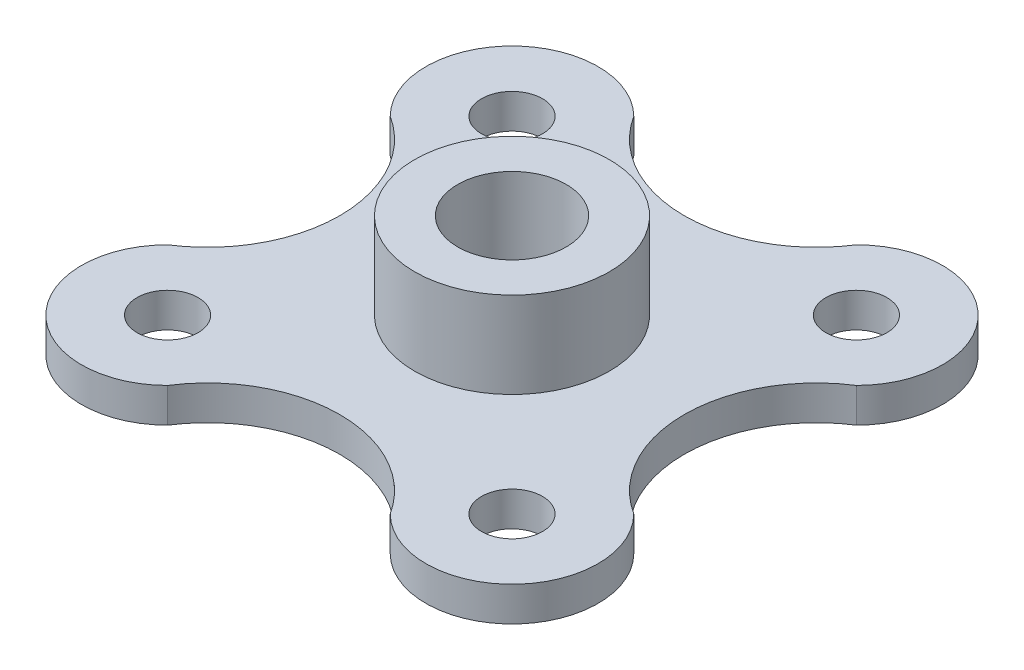
ISO-10303-21;
HEADER;
FILE_DESCRIPTION(('STEP AP214'),'2;1');
FILE_NAME('part.step','',(''),(''),'','','');
FILE_SCHEMA(('AUTOMOTIVE_DESIGN { 1 0 10303 214 1 1 1 1 }'));
ENDSEC;
DATA;
#1=APPLICATION_CONTEXT('core data for automotive mechanical design processes');
#2=APPLICATION_PROTOCOL_DEFINITION('international standard','automotive_design',2000,#1);
#3=PRODUCT_CONTEXT('',#1,'mechanical');
#4=PRODUCT('Part','Part','',(#3));
#5=PRODUCT_RELATED_PRODUCT_CATEGORY('part','',(#4));
#6=PRODUCT_DEFINITION_FORMATION('','',#4);
#7=PRODUCT_DEFINITION_CONTEXT('part definition',#1,'design');
#8=PRODUCT_DEFINITION('design','',#6,#7);
#9=PRODUCT_DEFINITION_SHAPE('','',#8);
#10=(LENGTH_UNIT() NAMED_UNIT(*) SI_UNIT(.MILLI.,.METRE.));
#11=(NAMED_UNIT(*) PLANE_ANGLE_UNIT() SI_UNIT($,.RADIAN.));
#12=(NAMED_UNIT(*) SI_UNIT($,.STERADIAN.) SOLID_ANGLE_UNIT());
#13=UNCERTAINTY_MEASURE_WITH_UNIT(LENGTH_MEASURE(1.E-05),#10,'distance_accuracy_value','');
#14=(GEOMETRIC_REPRESENTATION_CONTEXT(3) GLOBAL_UNCERTAINTY_ASSIGNED_CONTEXT((#13)) GLOBAL_UNIT_ASSIGNED_CONTEXT((#10,
#11,#12)) REPRESENTATION_CONTEXT('',''));
#15=CARTESIAN_POINT('',(0.,0.,0.));
#16=DIRECTION('',(0.,0.,1.));
#17=DIRECTION('',(1.,0.,0.));
#18=AXIS2_PLACEMENT_3D('',#15,#16,#17);
#19=CARTESIAN_POINT('',(-12.7,2.54,12.7));
#20=DIRECTION('',(0.,-1.,0.));
#21=DIRECTION('',(0.,0.,-1.));
#22=AXIS2_PLACEMENT_3D('',#19,#20,#21);
#23=CYLINDRICAL_SURFACE('',#22,6.35);
#24=CARTESIAN_POINT('',(-12.7,0.,12.7));
#25=DIRECTION('',(0.,1.,0.));
#26=DIRECTION('',(0.,0.,1.));
#27=AXIS2_PLACEMENT_3D('',#24,#25,#26);
#28=CIRCLE('',#27,6.35);
#29=CARTESIAN_POINT('',(-17.1901280605346,0.,8.20987193946544));
#30=VERTEX_POINT('',#29);
#31=CARTESIAN_POINT('',(-8.20987193946544,0.,17.1901280605346));
#32=VERTEX_POINT('',#31);
#33=EDGE_CURVE('E142',#30,#32,#28,.T.);
#34=ORIENTED_EDGE('',*,*,#33,.T.);
#35=DIRECTION('',(0.,-1.,0.));
#36=VECTOR('',#35,1.);
#37=CARTESIAN_POINT('',(-8.20987193946544,2.54,17.1901280605346));
#38=LINE('',#37,#36);
#39=CARTESIAN_POINT('',(-8.20987193946544,2.54,17.1901280605346));
#40=VERTEX_POINT('',#39);
#41=EDGE_CURVE('E52',#40,#32,#38,.T.);
#42=ORIENTED_EDGE('',*,*,#41,.F.);
#43=CARTESIAN_POINT('',(-12.7,2.54,12.7));
#44=DIRECTION('',(0.,1.,0.));
#45=DIRECTION('',(0.,0.,1.));
#46=AXIS2_PLACEMENT_3D('',#43,#44,#45);
#47=CIRCLE('',#46,6.35);
#48=CARTESIAN_POINT('',(-17.1901280605346,2.54,8.20987193946544));
#49=VERTEX_POINT('',#48);
#50=EDGE_CURVE('E158',#49,#40,#47,.T.);
#51=ORIENTED_EDGE('',*,*,#50,.F.);
#52=DIRECTION('',(0.,-1.,0.));
#53=VECTOR('',#52,1.);
#54=CARTESIAN_POINT('',(-17.1901280605346,2.54,8.20987193946544));
#55=LINE('',#54,#53);
#56=EDGE_CURVE('E141',#49,#30,#55,.T.);
#57=ORIENTED_EDGE('',*,*,#56,.T.);
#58=EDGE_LOOP('',(#34,#42,#51,#57));
#59=FACE_BOUND('',#58,.T.);
#60=ADVANCED_FACE('F44',(#59),#23,.T.);
#61=CARTESIAN_POINT('',(0.,2.54,22.4506403026729));
#62=DIRECTION('',(0.,-1.,0.));
#63=DIRECTION('',(0.,0.,-1.));
#64=AXIS2_PLACEMENT_3D('',#61,#62,#63);
#65=CYLINDRICAL_SURFACE('',#64,9.75064030267288);
#66=CARTESIAN_POINT('',(0.,0.,22.4506403026729));
#67=DIRECTION('',(0.,1.,0.));
#68=DIRECTION('',(0.,0.,1.));
#69=AXIS2_PLACEMENT_3D('',#66,#67,#68);
#70=CIRCLE('',#69,9.75064030267288);
#71=CARTESIAN_POINT('',(8.20987193946543,0.,17.1901280605346));
#72=VERTEX_POINT('',#71);
#73=EDGE_CURVE('E145',#32,#72,#70,.F.);
#74=ORIENTED_EDGE('',*,*,#73,.T.);
#75=DIRECTION('',(0.,-1.,0.));
#76=VECTOR('',#75,1.);
#77=CARTESIAN_POINT('',(8.20987193946543,2.54,17.1901280605346));
#78=LINE('',#77,#76);
#79=CARTESIAN_POINT('',(8.20987193946543,2.54,17.1901280605346));
#80=VERTEX_POINT('',#79);
#81=EDGE_CURVE('E168',#80,#72,#78,.T.);
#82=ORIENTED_EDGE('',*,*,#81,.F.);
#83=CARTESIAN_POINT('',(0.,2.54,22.4506403026729));
#84=DIRECTION('',(0.,1.,0.));
#85=DIRECTION('',(0.,0.,1.));
#86=AXIS2_PLACEMENT_3D('',#83,#84,#85);
#87=CIRCLE('',#86,9.75064030267288);
#88=EDGE_CURVE('E103',#40,#80,#87,.F.);
#89=ORIENTED_EDGE('',*,*,#88,.F.);
#90=ORIENTED_EDGE('',*,*,#41,.T.);
#91=EDGE_LOOP('',(#74,#82,#89,#90));
#92=FACE_BOUND('',#91,.T.);
#93=ADVANCED_FACE('F171',(#92),#65,.F.);
#94=CARTESIAN_POINT('',(12.7,2.54,12.7));
#95=DIRECTION('',(0.,-1.,0.));
#96=DIRECTION('',(0.,0.,-1.));
#97=AXIS2_PLACEMENT_3D('',#94,#95,#96);
#98=CYLINDRICAL_SURFACE('',#97,6.35);
#99=CARTESIAN_POINT('',(12.7,0.,12.7));
#100=DIRECTION('',(0.,1.,0.));
#101=DIRECTION('',(0.,0.,1.));
#102=AXIS2_PLACEMENT_3D('',#99,#100,#101);
#103=CIRCLE('',#102,6.35);
#104=CARTESIAN_POINT('',(17.1901280605346,0.,8.20987193946543));
#105=VERTEX_POINT('',#104);
#106=EDGE_CURVE('E148',#72,#105,#103,.T.);
#107=ORIENTED_EDGE('',*,*,#106,.T.);
#108=DIRECTION('',(0.,-1.,0.));
#109=VECTOR('',#108,1.);
#110=CARTESIAN_POINT('',(17.1901280605346,2.54,8.20987193946543));
#111=LINE('',#110,#109);
#112=CARTESIAN_POINT('',(17.1901280605346,2.54,8.20987193946543));
#113=VERTEX_POINT('',#112);
#114=EDGE_CURVE('E165',#113,#105,#111,.T.);
#115=ORIENTED_EDGE('',*,*,#114,.F.);
#116=CARTESIAN_POINT('',(12.7,2.54,12.7));
#117=DIRECTION('',(0.,1.,0.));
#118=DIRECTION('',(0.,0.,1.));
#119=AXIS2_PLACEMENT_3D('',#116,#117,#118);
#120=CIRCLE('',#119,6.35);
#121=EDGE_CURVE('E188',#80,#113,#120,.T.);
#122=ORIENTED_EDGE('',*,*,#121,.F.);
#123=ORIENTED_EDGE('',*,*,#81,.T.);
#124=EDGE_LOOP('',(#107,#115,#122,#123));
#125=FACE_BOUND('',#124,.T.);
#126=ADVANCED_FACE('F182',(#125),#98,.T.);
#127=CARTESIAN_POINT('',(22.4506403026729,2.54,0.));
#128=DIRECTION('',(0.,-1.,0.));
#129=DIRECTION('',(0.,0.,-1.));
#130=AXIS2_PLACEMENT_3D('',#127,#128,#129);
#131=CYLINDRICAL_SURFACE('',#130,9.75064030267289);
#132=CARTESIAN_POINT('',(22.4506403026729,0.,0.));
#133=DIRECTION('',(0.,1.,0.));
#134=DIRECTION('',(0.,0.,1.));
#135=AXIS2_PLACEMENT_3D('',#132,#133,#134);
#136=CIRCLE('',#135,9.75064030267289);
#137=CARTESIAN_POINT('',(17.1901280605346,0.,-8.20987193946545));
#138=VERTEX_POINT('',#137);
#139=EDGE_CURVE('E150',#105,#138,#136,.F.);
#140=ORIENTED_EDGE('',*,*,#139,.T.);
#141=DIRECTION('',(0.,-1.,0.));
#142=VECTOR('',#141,1.);
#143=CARTESIAN_POINT('',(17.1901280605346,2.54,-8.20987193946545));
#144=LINE('',#143,#142);
#145=CARTESIAN_POINT('',(17.1901280605346,2.54,-8.20987193946545));
#146=VERTEX_POINT('',#145);
#147=EDGE_CURVE('E162',#146,#138,#144,.T.);
#148=ORIENTED_EDGE('',*,*,#147,.F.);
#149=CARTESIAN_POINT('',(22.4506403026729,2.54,0.));
#150=DIRECTION('',(0.,1.,0.));
#151=DIRECTION('',(0.,0.,1.));
#152=AXIS2_PLACEMENT_3D('',#149,#150,#151);
#153=CIRCLE('',#152,9.75064030267289);
#154=EDGE_CURVE('E136',#113,#146,#153,.F.);
#155=ORIENTED_EDGE('',*,*,#154,.F.);
#156=ORIENTED_EDGE('',*,*,#114,.T.);
#157=EDGE_LOOP('',(#140,#148,#155,#156));
#158=FACE_BOUND('',#157,.T.);
#159=ADVANCED_FACE('F186',(#158),#131,.F.);
#160=CARTESIAN_POINT('',(12.7,2.54,-12.7));
#161=DIRECTION('',(0.,-1.,0.));
#162=DIRECTION('',(0.,0.,-1.));
#163=AXIS2_PLACEMENT_3D('',#160,#161,#162);
#164=CYLINDRICAL_SURFACE('',#163,6.35);
#165=CARTESIAN_POINT('',(12.7,0.,-12.7));
#166=DIRECTION('',(0.,1.,0.));
#167=DIRECTION('',(0.,0.,1.));
#168=AXIS2_PLACEMENT_3D('',#165,#166,#167);
#169=CIRCLE('',#168,6.35);
#170=CARTESIAN_POINT('',(8.20987193946543,0.,-17.1901280605346));
#171=VERTEX_POINT('',#170);
#172=EDGE_CURVE('E152',#138,#171,#169,.T.);
#173=ORIENTED_EDGE('',*,*,#172,.T.);
#174=DIRECTION('',(0.,-1.,0.));
#175=VECTOR('',#174,1.);
#176=CARTESIAN_POINT('',(8.20987193946543,2.54,-17.1901280605346));
#177=LINE('',#176,#175);
#178=CARTESIAN_POINT('',(8.20987193946543,2.54,-17.1901280605346));
#179=VERTEX_POINT('',#178);
#180=EDGE_CURVE('E125',#179,#171,#177,.T.);
#181=ORIENTED_EDGE('',*,*,#180,.F.);
#182=CARTESIAN_POINT('',(12.7,2.54,-12.7));
#183=DIRECTION('',(0.,1.,0.));
#184=DIRECTION('',(0.,0.,1.));
#185=AXIS2_PLACEMENT_3D('',#182,#183,#184);
#186=CIRCLE('',#185,6.35);
#187=EDGE_CURVE('E133',#146,#179,#186,.T.);
#188=ORIENTED_EDGE('',*,*,#187,.F.);
#189=ORIENTED_EDGE('',*,*,#147,.T.);
#190=EDGE_LOOP('',(#173,#181,#188,#189));
#191=FACE_BOUND('',#190,.T.);
#192=ADVANCED_FACE('F267',(#191),#164,.T.);
#193=CARTESIAN_POINT('',(0.,2.54,-22.4506403026729));
#194=DIRECTION('',(0.,-1.,0.));
#195=DIRECTION('',(0.,0.,-1.));
#196=AXIS2_PLACEMENT_3D('',#193,#194,#195);
#197=CYLINDRICAL_SURFACE('',#196,9.75064030267288);
#198=CARTESIAN_POINT('',(0.,0.,-22.4506403026729));
#199=DIRECTION('',(0.,1.,0.));
#200=DIRECTION('',(0.,0.,1.));
#201=AXIS2_PLACEMENT_3D('',#198,#199,#200);
#202=CIRCLE('',#201,9.75064030267288);
#203=CARTESIAN_POINT('',(-8.20987193946543,0.,-17.1901280605346));
#204=VERTEX_POINT('',#203);
#205=EDGE_CURVE('E124',#204,#171,#202,.T.);
#206=ORIENTED_EDGE('',*,*,#205,.F.);
#207=DIRECTION('',(0.,-1.,0.));
#208=VECTOR('',#207,1.);
#209=CARTESIAN_POINT('',(-8.20987193946543,2.54,-17.1901280605346));
#210=LINE('',#209,#208);
#211=CARTESIAN_POINT('',(-8.20987193946543,2.54,-17.1901280605346));
#212=VERTEX_POINT('',#211);
#213=EDGE_CURVE('E118',#212,#204,#210,.T.);
#214=ORIENTED_EDGE('',*,*,#213,.F.);
#215=CARTESIAN_POINT('',(0.,2.54,-22.4506403026729));
#216=DIRECTION('',(0.,1.,0.));
#217=DIRECTION('',(0.,0.,1.));
#218=AXIS2_PLACEMENT_3D('',#215,#216,#217);
#219=CIRCLE('',#218,9.75064030267288);
#220=EDGE_CURVE('E122',#212,#179,#219,.T.);
#221=ORIENTED_EDGE('',*,*,#220,.T.);
#222=ORIENTED_EDGE('',*,*,#180,.T.);
#223=EDGE_LOOP('',(#206,#214,#221,#222));
#224=FACE_BOUND('',#223,.T.);
#225=ADVANCED_FACE('F120',(#224),#197,.F.);
#226=CARTESIAN_POINT('',(-12.7,2.54,-12.7));
#227=DIRECTION('',(0.,-1.,0.));
#228=DIRECTION('',(0.,0.,-1.));
#229=AXIS2_PLACEMENT_3D('',#226,#227,#228);
#230=CYLINDRICAL_SURFACE('',#229,6.35);
#231=CARTESIAN_POINT('',(-12.7,0.,-12.7));
#232=DIRECTION('',(0.,1.,0.));
#233=DIRECTION('',(0.,0.,1.));
#234=AXIS2_PLACEMENT_3D('',#231,#232,#233);
#235=CIRCLE('',#234,6.35);
#236=CARTESIAN_POINT('',(-17.1901280605346,0.,-8.20987193946544));
#237=VERTEX_POINT('',#236);
#238=EDGE_CURVE('E88',#204,#237,#235,.T.);
#239=ORIENTED_EDGE('',*,*,#238,.T.);
#240=DIRECTION('',(0.,-1.,0.));
#241=VECTOR('',#240,1.);
#242=CARTESIAN_POINT('',(-17.1901280605346,2.54,-8.20987193946544));
#243=LINE('',#242,#241);
#244=CARTESIAN_POINT('',(-17.1901280605346,2.54,-8.20987193946544));
#245=VERTEX_POINT('',#244);
#246=EDGE_CURVE('E126',#245,#237,#243,.T.);
#247=ORIENTED_EDGE('',*,*,#246,.F.);
#248=CARTESIAN_POINT('',(-12.7,2.54,-12.7));
#249=DIRECTION('',(0.,1.,0.));
#250=DIRECTION('',(0.,0.,1.));
#251=AXIS2_PLACEMENT_3D('',#248,#249,#250);
#252=CIRCLE('',#251,6.35);
#253=EDGE_CURVE('E128',#212,#245,#252,.T.);
#254=ORIENTED_EDGE('',*,*,#253,.F.);
#255=ORIENTED_EDGE('',*,*,#213,.T.);
#256=EDGE_LOOP('',(#239,#247,#254,#255));
#257=FACE_BOUND('',#256,.T.);
#258=ADVANCED_FACE('F129',(#257),#230,.T.);
#259=CARTESIAN_POINT('',(-22.4506403026729,2.54,0.));
#260=DIRECTION('',(0.,-1.,0.));
#261=DIRECTION('',(0.,0.,-1.));
#262=AXIS2_PLACEMENT_3D('',#259,#260,#261);
#263=CYLINDRICAL_SURFACE('',#262,9.75064030267289);
#264=CARTESIAN_POINT('',(-22.4506403026729,0.,0.));
#265=DIRECTION('',(0.,1.,0.));
#266=DIRECTION('',(0.,0.,1.));
#267=AXIS2_PLACEMENT_3D('',#264,#265,#266);
#268=CIRCLE('',#267,9.75064030267289);
#269=EDGE_CURVE('E94',#237,#30,#268,.F.);
#270=ORIENTED_EDGE('',*,*,#269,.T.);
#271=ORIENTED_EDGE('',*,*,#56,.F.);
#272=CARTESIAN_POINT('',(-22.4506403026729,2.54,0.));
#273=DIRECTION('',(0.,1.,0.));
#274=DIRECTION('',(0.,0.,1.));
#275=AXIS2_PLACEMENT_3D('',#272,#273,#274);
#276=CIRCLE('',#275,9.75064030267289);
#277=EDGE_CURVE('E60',#245,#49,#276,.F.);
#278=ORIENTED_EDGE('',*,*,#277,.F.);
#279=ORIENTED_EDGE('',*,*,#246,.T.);
#280=EDGE_LOOP('',(#270,#271,#278,#279));
#281=FACE_BOUND('',#280,.T.);
#282=ADVANCED_FACE('F230',(#281),#263,.F.);
#283=CARTESIAN_POINT('',(0.,2.54,0.));
#284=DIRECTION('',(0.,1.,0.));
#285=DIRECTION('',(0.,0.,1.));
#286=AXIS2_PLACEMENT_3D('',#283,#284,#285);
#287=PLANE('',#286);
#288=CARTESIAN_POINT('',(-12.7,2.54,-12.7));
#289=DIRECTION('',(0.,1.,0.));
#290=DIRECTION('',(0.,0.,1.));
#291=AXIS2_PLACEMENT_3D('',#288,#289,#290);
#292=CIRCLE('',#291,2.24789999999999);
#293=CARTESIAN_POINT('',(-12.7,2.54,-10.4521));
#294=VERTEX_POINT('',#293);
#295=EDGE_CURVE('E222',#294,#294,#292,.T.);
#296=ORIENTED_EDGE('',*,*,#295,.F.);
#297=EDGE_LOOP('',(#296));
#298=FACE_BOUND('',#297,.T.);
#299=CARTESIAN_POINT('',(12.7,2.54,-12.7));
#300=DIRECTION('',(0.,1.,0.));
#301=DIRECTION('',(0.,0.,1.));
#302=AXIS2_PLACEMENT_3D('',#299,#300,#301);
#303=CIRCLE('',#302,2.24789999999999);
#304=CARTESIAN_POINT('',(12.7,2.54,-10.4521));
#305=VERTEX_POINT('',#304);
#306=EDGE_CURVE('E216',#305,#305,#303,.T.);
#307=ORIENTED_EDGE('',*,*,#306,.F.);
#308=EDGE_LOOP('',(#307));
#309=FACE_BOUND('',#308,.T.);
#310=CARTESIAN_POINT('',(12.7,2.54,12.7));
#311=DIRECTION('',(0.,1.,0.));
#312=DIRECTION('',(0.,0.,1.));
#313=AXIS2_PLACEMENT_3D('',#310,#311,#312);
#314=CIRCLE('',#313,2.24789999999999);
#315=CARTESIAN_POINT('',(12.7,2.54,14.9479));
#316=VERTEX_POINT('',#315);
#317=EDGE_CURVE('E210',#316,#316,#314,.T.);
#318=ORIENTED_EDGE('',*,*,#317,.F.);
#319=EDGE_LOOP('',(#318));
#320=FACE_BOUND('',#319,.T.);
#321=CARTESIAN_POINT('',(-12.7,2.54,12.7));
#322=DIRECTION('',(0.,1.,0.));
#323=DIRECTION('',(0.,0.,1.));
#324=AXIS2_PLACEMENT_3D('',#321,#322,#323);
#325=CIRCLE('',#324,2.24789999999999);
#326=CARTESIAN_POINT('',(-12.7,2.54,14.9479));
#327=VERTEX_POINT('',#326);
#328=EDGE_CURVE('E204',#327,#327,#325,.T.);
#329=ORIENTED_EDGE('',*,*,#328,.F.);
#330=EDGE_LOOP('',(#329));
#331=FACE_BOUND('',#330,.T.);
#332=CARTESIAN_POINT('',(0.,2.54,0.));
#333=DIRECTION('',(0.,1.,0.));
#334=DIRECTION('',(0.,0.,1.));
#335=AXIS2_PLACEMENT_3D('',#332,#333,#334);
#336=CIRCLE('',#335,7.175);
#337=CARTESIAN_POINT('',(0.,2.54,7.175));
#338=VERTEX_POINT('',#337);
#339=EDGE_CURVE('E193',#338,#338,#336,.T.);
#340=ORIENTED_EDGE('',*,*,#339,.F.);
#341=EDGE_LOOP('',(#340));
#342=FACE_BOUND('',#341,.T.);
#343=ORIENTED_EDGE('',*,*,#50,.T.);
#344=ORIENTED_EDGE('',*,*,#88,.T.);
#345=ORIENTED_EDGE('',*,*,#121,.T.);
#346=ORIENTED_EDGE('',*,*,#154,.T.);
#347=ORIENTED_EDGE('',*,*,#187,.T.);
#348=ORIENTED_EDGE('',*,*,#220,.F.);
#349=ORIENTED_EDGE('',*,*,#253,.T.);
#350=ORIENTED_EDGE('',*,*,#277,.T.);
#351=EDGE_LOOP('',(#343,#344,#345,#346,#347,#348,#349,#350));
#352=FACE_BOUND('',#351,.T.);
#353=ADVANCED_FACE('F131',(#298,#309,#320,#331,#342,#352),#287,.T.);
#354=CARTESIAN_POINT('',(0.,0.,0.));
#355=DIRECTION('',(0.,1.,0.));
#356=DIRECTION('',(0.,0.,1.));
#357=AXIS2_PLACEMENT_3D('',#354,#355,#356);
#358=PLANE('',#357);
#359=CARTESIAN_POINT('',(-12.7,0.,-12.7));
#360=DIRECTION('',(0.,1.,0.));
#361=DIRECTION('',(0.,0.,1.));
#362=AXIS2_PLACEMENT_3D('',#359,#360,#361);
#363=CIRCLE('',#362,2.2479);
#364=CARTESIAN_POINT('',(-12.7,0.,-10.4521));
#365=VERTEX_POINT('',#364);
#366=EDGE_CURVE('E219',#365,#365,#363,.T.);
#367=ORIENTED_EDGE('',*,*,#366,.T.);
#368=EDGE_LOOP('',(#367));
#369=FACE_BOUND('',#368,.T.);
#370=CARTESIAN_POINT('',(12.7,0.,-12.7));
#371=DIRECTION('',(0.,1.,0.));
#372=DIRECTION('',(0.,0.,1.));
#373=AXIS2_PLACEMENT_3D('',#370,#371,#372);
#374=CIRCLE('',#373,2.2479);
#375=CARTESIAN_POINT('',(12.7,0.,-10.4521));
#376=VERTEX_POINT('',#375);
#377=EDGE_CURVE('E213',#376,#376,#374,.T.);
#378=ORIENTED_EDGE('',*,*,#377,.T.);
#379=EDGE_LOOP('',(#378));
#380=FACE_BOUND('',#379,.T.);
#381=CARTESIAN_POINT('',(12.7,0.,12.7));
#382=DIRECTION('',(0.,1.,0.));
#383=DIRECTION('',(0.,0.,1.));
#384=AXIS2_PLACEMENT_3D('',#381,#382,#383);
#385=CIRCLE('',#384,2.2479);
#386=CARTESIAN_POINT('',(12.7,0.,14.9479));
#387=VERTEX_POINT('',#386);
#388=EDGE_CURVE('E207',#387,#387,#385,.T.);
#389=ORIENTED_EDGE('',*,*,#388,.T.);
#390=EDGE_LOOP('',(#389));
#391=FACE_BOUND('',#390,.T.);
#392=CARTESIAN_POINT('',(-12.7,0.,12.7));
#393=DIRECTION('',(0.,1.,0.));
#394=DIRECTION('',(0.,0.,1.));
#395=AXIS2_PLACEMENT_3D('',#392,#393,#394);
#396=CIRCLE('',#395,2.2479);
#397=CARTESIAN_POINT('',(-12.7,0.,14.9479));
#398=VERTEX_POINT('',#397);
#399=EDGE_CURVE('E201',#398,#398,#396,.T.);
#400=ORIENTED_EDGE('',*,*,#399,.T.);
#401=EDGE_LOOP('',(#400));
#402=FACE_BOUND('',#401,.T.);
#403=ORIENTED_EDGE('',*,*,#33,.F.);
#404=ORIENTED_EDGE('',*,*,#269,.F.);
#405=ORIENTED_EDGE('',*,*,#238,.F.);
#406=ORIENTED_EDGE('',*,*,#205,.T.);
#407=ORIENTED_EDGE('',*,*,#172,.F.);
#408=ORIENTED_EDGE('',*,*,#139,.F.);
#409=ORIENTED_EDGE('',*,*,#106,.F.);
#410=ORIENTED_EDGE('',*,*,#73,.F.);
#411=EDGE_LOOP('',(#403,#404,#405,#406,#407,#408,#409,#410));
#412=FACE_BOUND('',#411,.T.);
#413=ADVANCED_FACE('F176',(#369,#380,#391,#402,#412),#358,.F.);
#414=CARTESIAN_POINT('',(0.,8.89,0.));
#415=DIRECTION('',(0.,1.,0.));
#416=DIRECTION('',(0.,0.,1.));
#417=AXIS2_PLACEMENT_3D('',#414,#415,#416);
#418=PLANE('',#417);
#419=CARTESIAN_POINT('',(0.,8.89,0.));
#420=DIRECTION('',(0.,1.,0.));
#421=DIRECTION('',(0.,0.,1.));
#422=AXIS2_PLACEMENT_3D('',#419,#420,#421);
#423=CIRCLE('',#422,7.175);
#424=CARTESIAN_POINT('',(0.,8.89,7.175));
#425=VERTEX_POINT('',#424);
#426=EDGE_CURVE('E146',#425,#425,#423,.T.);
#427=ORIENTED_EDGE('',*,*,#426,.T.);
#428=EDGE_LOOP('',(#427));
#429=FACE_BOUND('',#428,.T.);
#430=CARTESIAN_POINT('',(0.,8.89,0.));
#431=DIRECTION('',(0.,1.,0.));
#432=DIRECTION('',(0.,0.,1.));
#433=AXIS2_PLACEMENT_3D('',#430,#431,#432);
#434=CIRCLE('',#433,4.);
#435=CARTESIAN_POINT('',(0.,8.89,4.));
#436=VERTEX_POINT('',#435);
#437=EDGE_CURVE('E196',#436,#436,#434,.T.);
#438=ORIENTED_EDGE('',*,*,#437,.F.);
#439=EDGE_LOOP('',(#438));
#440=FACE_BOUND('',#439,.T.);
#441=ADVANCED_FACE('F244',(#429,#440),#418,.T.);
#442=CARTESIAN_POINT('',(0.,8.89,0.));
#443=DIRECTION('',(0.,-1.,0.));
#444=DIRECTION('',(0.,0.,-1.));
#445=AXIS2_PLACEMENT_3D('',#442,#443,#444);
#446=CYLINDRICAL_SURFACE('',#445,7.175);
#447=ORIENTED_EDGE('',*,*,#426,.F.);
#448=EDGE_LOOP('',(#447));
#449=FACE_BOUND('',#448,.T.);
#450=ORIENTED_EDGE('',*,*,#339,.T.);
#451=EDGE_LOOP('',(#450));
#452=FACE_BOUND('',#451,.T.);
#453=ADVANCED_FACE('F241',(#449,#452),#446,.T.);
#454=CARTESIAN_POINT('',(0.,8.89,0.));
#455=DIRECTION('',(0.,-1.,0.));
#456=DIRECTION('',(0.,0.,-1.));
#457=AXIS2_PLACEMENT_3D('',#454,#455,#456);
#458=CYLINDRICAL_SURFACE('',#457,4.);
#459=ORIENTED_EDGE('',*,*,#437,.T.);
#460=EDGE_LOOP('',(#459));
#461=FACE_BOUND('',#460,.T.);
#462=CARTESIAN_POINT('',(0.,2.54,0.));
#463=DIRECTION('',(0.,1.,0.));
#464=DIRECTION('',(0.,0.,1.));
#465=AXIS2_PLACEMENT_3D('',#462,#463,#464);
#466=CIRCLE('',#465,4.);
#467=CARTESIAN_POINT('',(0.,2.54,4.));
#468=VERTEX_POINT('',#467);
#469=EDGE_CURVE('E12',#468,#468,#466,.F.);
#470=ORIENTED_EDGE('',*,*,#469,.T.);
#471=EDGE_LOOP('',(#470));
#472=FACE_BOUND('',#471,.T.);
#473=ADVANCED_FACE('F243',(#461,#472),#458,.F.);
#474=ORIENTED_EDGE('',*,*,#469,.F.);
#475=EDGE_LOOP('',(#474));
#476=FACE_BOUND('',#475,.T.);
#477=ADVANCED_FACE('F232',(#476),#287,.T.);
#478=CARTESIAN_POINT('',(-12.7,2.54,12.7));
#479=DIRECTION('',(0.,1.,0.));
#480=DIRECTION('',(0.,0.,1.));
#481=AXIS2_PLACEMENT_3D('',#478,#479,#480);
#482=CYLINDRICAL_SURFACE('',#481,2.24789999999999);
#483=ORIENTED_EDGE('',*,*,#399,.F.);
#484=EDGE_LOOP('',(#483));
#485=FACE_BOUND('',#484,.T.);
#486=ORIENTED_EDGE('',*,*,#328,.T.);
#487=EDGE_LOOP('',(#486));
#488=FACE_BOUND('',#487,.T.);
#489=ADVANCED_FACE('F289',(#485,#488),#482,.F.);
#490=CARTESIAN_POINT('',(12.7,2.54,12.7));
#491=DIRECTION('',(0.,1.,0.));
#492=DIRECTION('',(0.,0.,1.));
#493=AXIS2_PLACEMENT_3D('',#490,#491,#492);
#494=CYLINDRICAL_SURFACE('',#493,2.24789999999999);
#495=ORIENTED_EDGE('',*,*,#388,.F.);
#496=EDGE_LOOP('',(#495));
#497=FACE_BOUND('',#496,.T.);
#498=ORIENTED_EDGE('',*,*,#317,.T.);
#499=EDGE_LOOP('',(#498));
#500=FACE_BOUND('',#499,.T.);
#501=ADVANCED_FACE('F292',(#497,#500),#494,.F.);
#502=CARTESIAN_POINT('',(12.7,2.54,-12.7));
#503=DIRECTION('',(0.,1.,0.));
#504=DIRECTION('',(0.,0.,1.));
#505=AXIS2_PLACEMENT_3D('',#502,#503,#504);
#506=CYLINDRICAL_SURFACE('',#505,2.24789999999999);
#507=ORIENTED_EDGE('',*,*,#377,.F.);
#508=EDGE_LOOP('',(#507));
#509=FACE_BOUND('',#508,.T.);
#510=ORIENTED_EDGE('',*,*,#306,.T.);
#511=EDGE_LOOP('',(#510));
#512=FACE_BOUND('',#511,.T.);
#513=ADVANCED_FACE('F298',(#509,#512),#506,.F.);
#514=CARTESIAN_POINT('',(-12.7,2.54,-12.7));
#515=DIRECTION('',(0.,1.,0.));
#516=DIRECTION('',(0.,0.,1.));
#517=AXIS2_PLACEMENT_3D('',#514,#515,#516);
#518=CYLINDRICAL_SURFACE('',#517,2.24789999999999);
#519=ORIENTED_EDGE('',*,*,#366,.F.);
#520=EDGE_LOOP('',(#519));
#521=FACE_BOUND('',#520,.T.);
#522=ORIENTED_EDGE('',*,*,#295,.T.);
#523=EDGE_LOOP('',(#522));
#524=FACE_BOUND('',#523,.T.);
#525=ADVANCED_FACE('F226',(#521,#524),#518,.F.);
#526=CLOSED_SHELL('',(#60,#93,#126,#159,#192,#225,#258,#282,#353,#413,#441,#453,#473,#477,#489,
#501,#513,#525));
#527=MANIFOLD_SOLID_BREP('B2',#526);
#528=ADVANCED_BREP_SHAPE_REPRESENTATION('',(#18,#527),#14);
#529=SHAPE_DEFINITION_REPRESENTATION(#9,#528);
ENDSEC;
END-ISO-10303-21;
